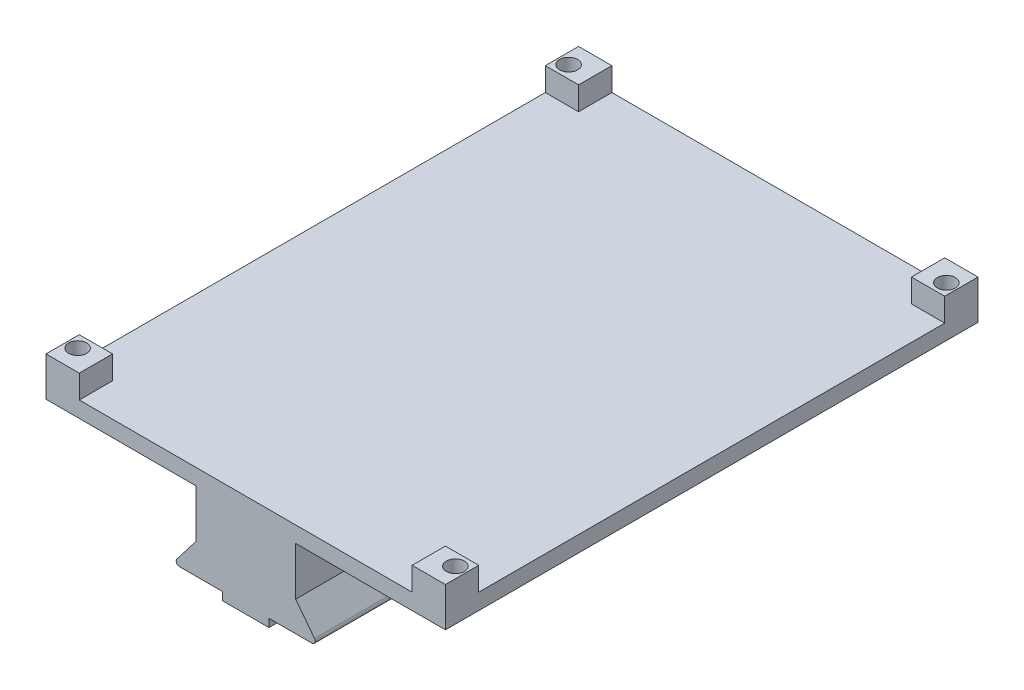
ISO-10303-21;
HEADER;
FILE_DESCRIPTION(('STEP AP214'),'2;1');
FILE_NAME('part.step','',(''),(''),'','','');
FILE_SCHEMA(('AUTOMOTIVE_DESIGN { 1 0 10303 214 1 1 1 1 }'));
ENDSEC;
DATA;
#1=APPLICATION_CONTEXT('core data for automotive mechanical design processes');
#2=APPLICATION_PROTOCOL_DEFINITION('international standard','automotive_design',2000,#1);
#3=PRODUCT_CONTEXT('',#1,'mechanical');
#4=PRODUCT('Part','Part','',(#3));
#5=PRODUCT_RELATED_PRODUCT_CATEGORY('part','',(#4));
#6=PRODUCT_DEFINITION_FORMATION('','',#4);
#7=PRODUCT_DEFINITION_CONTEXT('part definition',#1,'design');
#8=PRODUCT_DEFINITION('design','',#6,#7);
#9=PRODUCT_DEFINITION_SHAPE('','',#8);
#10=(LENGTH_UNIT() NAMED_UNIT(*) SI_UNIT(.MILLI.,.METRE.));
#11=(NAMED_UNIT(*) PLANE_ANGLE_UNIT() SI_UNIT($,.RADIAN.));
#12=(NAMED_UNIT(*) SI_UNIT($,.STERADIAN.) SOLID_ANGLE_UNIT());
#13=UNCERTAINTY_MEASURE_WITH_UNIT(LENGTH_MEASURE(1.E-05),#10,'distance_accuracy_value','');
#14=(GEOMETRIC_REPRESENTATION_CONTEXT(3) GLOBAL_UNCERTAINTY_ASSIGNED_CONTEXT((#13)) GLOBAL_UNIT_ASSIGNED_CONTEXT((#10,
#11,#12)) REPRESENTATION_CONTEXT('',''));
#15=CARTESIAN_POINT('',(0.,0.,0.));
#16=DIRECTION('',(0.,0.,1.));
#17=DIRECTION('',(1.,0.,0.));
#18=AXIS2_PLACEMENT_3D('',#15,#16,#17);
#19=CARTESIAN_POINT('',(38.1,19.5689499131827,101.6));
#20=DIRECTION('',(0.,-1.,0.));
#21=DIRECTION('',(1.,0.,0.));
#22=AXIS2_PLACEMENT_3D('',#19,#20,#21);
#23=PLANE('',#22);
#24=CARTESIAN_POINT('',(36.0362499999997,19.5689499131827,3.96874999999999));
#25=DIRECTION('',(0.,1.,0.));
#26=DIRECTION('',(0.,0.,1.));
#27=AXIS2_PLACEMENT_3D('',#24,#25,#26);
#28=CIRCLE('',#27,1.72719999999999);
#29=CARTESIAN_POINT('',(36.0362499999997,19.5689499131827,5.69594999999998));
#30=VERTEX_POINT('',#29);
#31=EDGE_CURVE('E281',#30,#30,#28,.T.);
#32=ORIENTED_EDGE('',*,*,#31,.F.);
#33=EDGE_LOOP('',(#32));
#34=FACE_BOUND('',#33,.T.);
#35=DIRECTION('',(0.,0.,-1.));
#36=VECTOR('',#35,1.);
#37=CARTESIAN_POINT('',(31.75,19.5689499131827,101.6));
#38=LINE('',#37,#36);
#39=CARTESIAN_POINT('',(31.75,19.5689499131827,6.34999999999999));
#40=VERTEX_POINT('',#39);
#41=CARTESIAN_POINT('',(31.75,19.5689499131827,0.));
#42=VERTEX_POINT('',#41);
#43=EDGE_CURVE('E247',#40,#42,#38,.T.);
#44=ORIENTED_EDGE('',*,*,#43,.F.);
#45=DIRECTION('',(-1.,0.,0.));
#46=VECTOR('',#45,1.);
#47=CARTESIAN_POINT('',(31.75,19.5689499131827,6.34999999999999));
#48=LINE('',#47,#46);
#49=CARTESIAN_POINT('',(38.1,19.5689499131827,6.34999999999999));
#50=VERTEX_POINT('',#49);
#51=EDGE_CURVE('E231',#50,#40,#48,.T.);
#52=ORIENTED_EDGE('',*,*,#51,.F.);
#53=DIRECTION('',(0.,0.,-1.));
#54=VECTOR('',#53,1.);
#55=CARTESIAN_POINT('',(38.1,19.5689499131827,101.6));
#56=LINE('',#55,#54);
#57=CARTESIAN_POINT('',(38.1,19.5689499131827,0.));
#58=VERTEX_POINT('',#57);
#59=EDGE_CURVE('E246',#50,#58,#56,.T.);
#60=ORIENTED_EDGE('',*,*,#59,.T.);
#61=DIRECTION('',(-1.,0.,0.));
#62=VECTOR('',#61,1.);
#63=CARTESIAN_POINT('',(38.1,19.5689499131827,0.));
#64=LINE('',#63,#62);
#65=EDGE_CURVE('E417',#58,#42,#64,.T.);
#66=ORIENTED_EDGE('',*,*,#65,.T.);
#67=EDGE_LOOP('',(#44,#52,#60,#66));
#68=FACE_BOUND('',#67,.T.);
#69=ADVANCED_FACE('F33',(#34,#68),#23,.F.);
#70=CARTESIAN_POINT('',(31.75,19.5689499131827,101.6));
#71=DIRECTION('',(1.,0.,0.));
#72=DIRECTION('',(0.,0.,-1.));
#73=AXIS2_PLACEMENT_3D('',#70,#71,#72);
#74=PLANE('',#73);
#75=DIRECTION('',(0.,0.,-1.));
#76=VECTOR('',#75,1.);
#77=CARTESIAN_POINT('',(31.75,15.1248300482848,101.6));
#78=LINE('',#77,#76);
#79=CARTESIAN_POINT('',(31.75,15.1248300482848,6.34999999999999));
#80=VERTEX_POINT('',#79);
#81=CARTESIAN_POINT('',(31.75,15.1248300482848,0.));
#82=VERTEX_POINT('',#81);
#83=EDGE_CURVE('E455',#80,#82,#78,.T.);
#84=ORIENTED_EDGE('',*,*,#83,.F.);
#85=DIRECTION('',(0.,1.,0.));
#86=VECTOR('',#85,1.);
#87=CARTESIAN_POINT('',(31.75,-74.0016671340908,6.34999999999999));
#88=LINE('',#87,#86);
#89=EDGE_CURVE('E50',#80,#40,#88,.T.);
#90=ORIENTED_EDGE('',*,*,#89,.T.);
#91=ORIENTED_EDGE('',*,*,#43,.T.);
#92=DIRECTION('',(0.,-1.,0.));
#93=VECTOR('',#92,1.);
#94=CARTESIAN_POINT('',(31.75,19.5689499131827,0.));
#95=LINE('',#94,#93);
#96=EDGE_CURVE('E420',#42,#82,#95,.T.);
#97=ORIENTED_EDGE('',*,*,#96,.T.);
#98=EDGE_LOOP('',(#84,#90,#91,#97));
#99=FACE_BOUND('',#98,.T.);
#100=ADVANCED_FACE('F559',(#99),#74,.F.);
#101=CARTESIAN_POINT('',(-31.75,19.5689499131827,101.6));
#102=DIRECTION('',(1.,0.,0.));
#103=DIRECTION('',(0.,0.,-1.));
#104=AXIS2_PLACEMENT_3D('',#101,#102,#103);
#105=PLANE('',#104);
#106=DIRECTION('',(0.,1.,0.));
#107=VECTOR('',#106,1.);
#108=CARTESIAN_POINT('',(-31.75,-74.0016671340908,6.34999999999999));
#109=LINE('',#108,#107);
#110=CARTESIAN_POINT('',(-31.75,15.1248300482848,6.34999999999999));
#111=VERTEX_POINT('',#110);
#112=CARTESIAN_POINT('',(-31.75,19.5689499131827,6.34999999999999));
#113=VERTEX_POINT('',#112);
#114=EDGE_CURVE('E326',#111,#113,#109,.T.);
#115=ORIENTED_EDGE('',*,*,#114,.F.);
#116=DIRECTION('',(0.,0.,-1.));
#117=VECTOR('',#116,1.);
#118=CARTESIAN_POINT('',(-31.75,15.1248300482848,101.6));
#119=LINE('',#118,#117);
#120=CARTESIAN_POINT('',(-31.75,15.1248300482848,0.));
#121=VERTEX_POINT('',#120);
#122=EDGE_CURVE('E452',#111,#121,#119,.T.);
#123=ORIENTED_EDGE('',*,*,#122,.T.);
#124=DIRECTION('',(0.,-1.,0.));
#125=VECTOR('',#124,1.);
#126=CARTESIAN_POINT('',(-31.75,19.5689499131827,0.));
#127=LINE('',#126,#125);
#128=CARTESIAN_POINT('',(-31.75,19.5689499131827,0.));
#129=VERTEX_POINT('',#128);
#130=EDGE_CURVE('E426',#129,#121,#127,.T.);
#131=ORIENTED_EDGE('',*,*,#130,.F.);
#132=DIRECTION('',(0.,0.,-1.));
#133=VECTOR('',#132,1.);
#134=CARTESIAN_POINT('',(-31.75,19.5689499131827,101.6));
#135=LINE('',#134,#133);
#136=EDGE_CURVE('E449',#113,#129,#135,.T.);
#137=ORIENTED_EDGE('',*,*,#136,.F.);
#138=EDGE_LOOP('',(#115,#123,#131,#137));
#139=FACE_BOUND('',#138,.T.);
#140=ADVANCED_FACE('F462',(#139),#105,.T.);
#141=CARTESIAN_POINT('',(-38.1,19.5689499131827,101.6));
#142=DIRECTION('',(0.,1.,0.));
#143=DIRECTION('',(0.,0.,1.));
#144=AXIS2_PLACEMENT_3D('',#141,#142,#143);
#145=PLANE('',#144);
#146=CARTESIAN_POINT('',(-36.0362500000004,19.5689499131827,3.96874999999999));
#147=DIRECTION('',(0.,1.,0.));
#148=DIRECTION('',(0.,0.,1.));
#149=AXIS2_PLACEMENT_3D('',#146,#147,#148);
#150=CIRCLE('',#149,1.72719999999999);
#151=CARTESIAN_POINT('',(-36.0362500000004,19.5689499131827,5.69594999999998));
#152=VERTEX_POINT('',#151);
#153=EDGE_CURVE('E298',#152,#152,#150,.T.);
#154=ORIENTED_EDGE('',*,*,#153,.F.);
#155=EDGE_LOOP('',(#154));
#156=FACE_BOUND('',#155,.T.);
#157=DIRECTION('',(-1.,0.,0.));
#158=VECTOR('',#157,1.);
#159=CARTESIAN_POINT('',(-38.1,19.5689499131827,6.34999999999999));
#160=LINE('',#159,#158);
#161=CARTESIAN_POINT('',(-38.1,19.5689499131827,6.34999999999999));
#162=VERTEX_POINT('',#161);
#163=EDGE_CURVE('E322',#113,#162,#160,.T.);
#164=ORIENTED_EDGE('',*,*,#163,.F.);
#165=ORIENTED_EDGE('',*,*,#136,.T.);
#166=DIRECTION('',(1.,0.,0.));
#167=VECTOR('',#166,1.);
#168=CARTESIAN_POINT('',(-38.1,19.5689499131827,0.));
#169=LINE('',#168,#167);
#170=CARTESIAN_POINT('',(-38.1,19.5689499131827,0.));
#171=VERTEX_POINT('',#170);
#172=EDGE_CURVE('E429',#171,#129,#169,.T.);
#173=ORIENTED_EDGE('',*,*,#172,.F.);
#174=DIRECTION('',(0.,0.,-1.));
#175=VECTOR('',#174,1.);
#176=CARTESIAN_POINT('',(-38.1,19.5689499131827,101.6));
#177=LINE('',#176,#175);
#178=EDGE_CURVE('E445',#162,#171,#177,.T.);
#179=ORIENTED_EDGE('',*,*,#178,.F.);
#180=EDGE_LOOP('',(#164,#165,#173,#179));
#181=FACE_BOUND('',#180,.T.);
#182=ADVANCED_FACE('F476',(#156,#181),#145,.T.);
#183=CARTESIAN_POINT('',(-9.525,2.8575,101.6));
#184=DIRECTION('',(0.793353340291239,-0.608761429008716,0.));
#185=DIRECTION('',(0.608761429008716,0.793353340291239,0.));
#186=AXIS2_PLACEMENT_3D('',#183,#184,#185);
#187=PLANE('',#186);
#188=DIRECTION('',(-0.608761429008716,-0.793353340291239,0.));
#189=VECTOR('',#188,1.);
#190=CARTESIAN_POINT('',(-9.525,2.8575,0.));
#191=LINE('',#190,#189);
#192=CARTESIAN_POINT('',(-9.525,2.8575,0.));
#193=VERTEX_POINT('',#192);
#194=CARTESIAN_POINT('',(-13.1264005164605,-1.83593653081475,0.));
#195=VERTEX_POINT('',#194);
#196=EDGE_CURVE('E333',#193,#195,#191,.T.);
#197=ORIENTED_EDGE('',*,*,#196,.T.);
#198=DIRECTION('',(0.,0.,-1.));
#199=VECTOR('',#198,1.);
#200=CARTESIAN_POINT('',(-13.1264005164605,-1.83593653081475,101.6));
#201=LINE('',#200,#199);
#202=CARTESIAN_POINT('',(-13.1264005164605,-1.83593653081475,101.6));
#203=VERTEX_POINT('',#202);
#204=EDGE_CURVE('E11',#203,#195,#201,.T.);
#205=ORIENTED_EDGE('',*,*,#204,.F.);
#206=DIRECTION('',(-0.608761429008716,-0.793353340291239,0.));
#207=VECTOR('',#206,1.);
#208=CARTESIAN_POINT('',(-9.525,2.8575,101.6));
#209=LINE('',#208,#207);
#210=CARTESIAN_POINT('',(-9.525,2.8575,101.6));
#211=VERTEX_POINT('',#210);
#212=EDGE_CURVE('E334',#211,#203,#209,.T.);
#213=ORIENTED_EDGE('',*,*,#212,.F.);
#214=DIRECTION('',(0.,0.,-1.));
#215=VECTOR('',#214,1.);
#216=CARTESIAN_POINT('',(-9.525,2.8575,101.6));
#217=LINE('',#216,#215);
#218=EDGE_CURVE('E385',#211,#193,#217,.T.);
#219=ORIENTED_EDGE('',*,*,#218,.T.);
#220=EDGE_LOOP('',(#197,#205,#213,#219));
#221=FACE_BOUND('',#220,.T.);
#222=ADVANCED_FACE('F35',(#221),#187,.F.);
#223=CARTESIAN_POINT('',(-12.6226211160366,-2.2225,101.6));
#224=DIRECTION('',(0.,0.,-1.));
#225=DIRECTION('',(-1.,0.,0.));
#226=AXIS2_PLACEMENT_3D('',#223,#224,#225);
#227=CYLINDRICAL_SURFACE('',#226,0.634999999999999);
#228=CARTESIAN_POINT('',(-12.6226211160366,-2.2225,0.));
#229=DIRECTION('',(0.,0.,1.));
#230=DIRECTION('',(1.,0.,0.));
#231=AXIS2_PLACEMENT_3D('',#228,#229,#230);
#232=CIRCLE('',#231,0.634999999999999);
#233=CARTESIAN_POINT('',(-12.622621186,-2.8575,0.));
#234=VERTEX_POINT('',#233);
#235=EDGE_CURVE('E388',#195,#234,#232,.T.);
#236=ORIENTED_EDGE('',*,*,#235,.T.);
#237=DIRECTION('',(0.,0.,-1.));
#238=VECTOR('',#237,1.);
#239=CARTESIAN_POINT('',(-12.622621186,-2.8575,101.6));
#240=LINE('',#239,#238);
#241=CARTESIAN_POINT('',(-12.622621186,-2.8575,101.6));
#242=VERTEX_POINT('',#241);
#243=EDGE_CURVE('E42',#242,#234,#240,.T.);
#244=ORIENTED_EDGE('',*,*,#243,.F.);
#245=CARTESIAN_POINT('',(-12.6226211160366,-2.2225,101.6));
#246=DIRECTION('',(0.,0.,1.));
#247=DIRECTION('',(1.,0.,0.));
#248=AXIS2_PLACEMENT_3D('',#245,#246,#247);
#249=CIRCLE('',#248,0.634999999999999);
#250=EDGE_CURVE('E337',#203,#242,#249,.T.);
#251=ORIENTED_EDGE('',*,*,#250,.F.);
#252=ORIENTED_EDGE('',*,*,#204,.T.);
#253=EDGE_LOOP('',(#236,#244,#251,#252));
#254=FACE_BOUND('',#253,.T.);
#255=ADVANCED_FACE('F509',(#254),#227,.T.);
#256=CARTESIAN_POINT('',(-9.525,-2.8575,101.6));
#257=DIRECTION('',(0.,1.,0.));
#258=DIRECTION('',(-1.,0.,0.));
#259=AXIS2_PLACEMENT_3D('',#256,#257,#258);
#260=PLANE('',#259);
#261=DIRECTION('',(1.,0.,0.));
#262=VECTOR('',#261,1.);
#263=CARTESIAN_POINT('',(-9.525,-2.8575,0.));
#264=LINE('',#263,#262);
#265=CARTESIAN_POINT('',(-4.445,-2.8575,0.));
#266=VERTEX_POINT('',#265);
#267=EDGE_CURVE('E391',#234,#266,#264,.T.);
#268=ORIENTED_EDGE('',*,*,#267,.T.);
#269=DIRECTION('',(0.,0.,-1.));
#270=VECTOR('',#269,1.);
#271=CARTESIAN_POINT('',(-4.445,-2.8575,101.6));
#272=LINE('',#271,#270);
#273=CARTESIAN_POINT('',(-4.445,-2.8575,101.6));
#274=VERTEX_POINT('',#273);
#275=EDGE_CURVE('E275',#274,#266,#272,.T.);
#276=ORIENTED_EDGE('',*,*,#275,.F.);
#277=DIRECTION('',(-1.,0.,0.));
#278=VECTOR('',#277,1.);
#279=CARTESIAN_POINT('',(-9.525,-2.8575,101.6));
#280=LINE('',#279,#278);
#281=EDGE_CURVE('E340',#274,#242,#280,.T.);
#282=ORIENTED_EDGE('',*,*,#281,.T.);
#283=ORIENTED_EDGE('',*,*,#243,.T.);
#284=EDGE_LOOP('',(#268,#276,#282,#283));
#285=FACE_BOUND('',#284,.T.);
#286=ADVANCED_FACE('F511',(#285),#260,.F.);
#287=CARTESIAN_POINT('',(-4.445,-2.8575,101.6));
#288=DIRECTION('',(1.,0.,0.));
#289=DIRECTION('',(0.,0.,-1.));
#290=AXIS2_PLACEMENT_3D('',#287,#288,#289);
#291=PLANE('',#290);
#292=DIRECTION('',(0.,-1.,0.));
#293=VECTOR('',#292,1.);
#294=CARTESIAN_POINT('',(-4.445,-2.8575,0.));
#295=LINE('',#294,#293);
#296=CARTESIAN_POINT('',(-4.445,-4.3815,0.));
#297=VERTEX_POINT('',#296);
#298=EDGE_CURVE('E393',#266,#297,#295,.T.);
#299=ORIENTED_EDGE('',*,*,#298,.T.);
#300=DIRECTION('',(0.,0.,-1.));
#301=VECTOR('',#300,1.);
#302=CARTESIAN_POINT('',(-4.445,-4.3815,101.6));
#303=LINE('',#302,#301);
#304=CARTESIAN_POINT('',(-4.445,-4.3815,101.6));
#305=VERTEX_POINT('',#304);
#306=EDGE_CURVE('E272',#305,#297,#303,.T.);
#307=ORIENTED_EDGE('',*,*,#306,.F.);
#308=DIRECTION('',(0.,-1.,0.));
#309=VECTOR('',#308,1.);
#310=CARTESIAN_POINT('',(-4.445,-2.8575,101.6));
#311=LINE('',#310,#309);
#312=EDGE_CURVE('E343',#274,#305,#311,.T.);
#313=ORIENTED_EDGE('',*,*,#312,.F.);
#314=ORIENTED_EDGE('',*,*,#275,.T.);
#315=EDGE_LOOP('',(#299,#307,#313,#314));
#316=FACE_BOUND('',#315,.T.);
#317=ADVANCED_FACE('F516',(#316),#291,.F.);
#318=CARTESIAN_POINT('',(-4.445,-4.3815,101.6));
#319=DIRECTION('',(0.,1.,0.));
#320=DIRECTION('',(-1.,0.,0.));
#321=AXIS2_PLACEMENT_3D('',#318,#319,#320);
#322=PLANE('',#321);
#323=DIRECTION('',(1.,0.,0.));
#324=VECTOR('',#323,1.);
#325=CARTESIAN_POINT('',(-4.445,-4.3815,0.));
#326=LINE('',#325,#324);
#327=CARTESIAN_POINT('',(4.445,-4.3815,0.));
#328=VERTEX_POINT('',#327);
#329=EDGE_CURVE('E395',#297,#328,#326,.T.);
#330=ORIENTED_EDGE('',*,*,#329,.T.);
#331=DIRECTION('',(0.,0.,-1.));
#332=VECTOR('',#331,1.);
#333=CARTESIAN_POINT('',(4.445,-4.3815,101.6));
#334=LINE('',#333,#332);
#335=CARTESIAN_POINT('',(4.445,-4.3815,101.6));
#336=VERTEX_POINT('',#335);
#337=EDGE_CURVE('E270',#336,#328,#334,.T.);
#338=ORIENTED_EDGE('',*,*,#337,.F.);
#339=DIRECTION('',(1.,0.,0.));
#340=VECTOR('',#339,1.);
#341=CARTESIAN_POINT('',(-4.445,-4.3815,101.6));
#342=LINE('',#341,#340);
#343=EDGE_CURVE('E345',#305,#336,#342,.T.);
#344=ORIENTED_EDGE('',*,*,#343,.F.);
#345=ORIENTED_EDGE('',*,*,#306,.T.);
#346=EDGE_LOOP('',(#330,#338,#344,#345));
#347=FACE_BOUND('',#346,.T.);
#348=ADVANCED_FACE('F521',(#347),#322,.F.);
#349=CARTESIAN_POINT('',(4.445,-2.8575,101.6));
#350=DIRECTION('',(1.,0.,0.));
#351=DIRECTION('',(0.,0.,-1.));
#352=AXIS2_PLACEMENT_3D('',#349,#350,#351);
#353=PLANE('',#352);
#354=DIRECTION('',(0.,-1.,0.));
#355=VECTOR('',#354,1.);
#356=CARTESIAN_POINT('',(4.445,-2.8575,0.));
#357=LINE('',#356,#355);
#358=CARTESIAN_POINT('',(4.445,-2.8575,0.));
#359=VERTEX_POINT('',#358);
#360=EDGE_CURVE('E398',#359,#328,#357,.T.);
#361=ORIENTED_EDGE('',*,*,#360,.F.);
#362=DIRECTION('',(0.,0.,-1.));
#363=VECTOR('',#362,1.);
#364=CARTESIAN_POINT('',(4.445,-2.8575,101.6));
#365=LINE('',#364,#363);
#366=CARTESIAN_POINT('',(4.445,-2.8575,101.6));
#367=VERTEX_POINT('',#366);
#368=EDGE_CURVE('E267',#367,#359,#365,.T.);
#369=ORIENTED_EDGE('',*,*,#368,.F.);
#370=DIRECTION('',(0.,-1.,0.));
#371=VECTOR('',#370,1.);
#372=CARTESIAN_POINT('',(4.445,-2.8575,101.6));
#373=LINE('',#372,#371);
#374=EDGE_CURVE('E347',#367,#336,#373,.T.);
#375=ORIENTED_EDGE('',*,*,#374,.T.);
#376=ORIENTED_EDGE('',*,*,#337,.T.);
#377=EDGE_LOOP('',(#361,#369,#375,#376));
#378=FACE_BOUND('',#377,.T.);
#379=ADVANCED_FACE('F525',(#378),#353,.T.);
#380=CARTESIAN_POINT('',(9.525,-2.8575,101.6));
#381=DIRECTION('',(0.,1.,0.));
#382=DIRECTION('',(-1.,0.,0.));
#383=AXIS2_PLACEMENT_3D('',#380,#381,#382);
#384=PLANE('',#383);
#385=DIRECTION('',(1.,0.,0.));
#386=VECTOR('',#385,1.);
#387=CARTESIAN_POINT('',(9.525,-2.8575,0.));
#388=LINE('',#387,#386);
#389=CARTESIAN_POINT('',(12.622621186,-2.8575,0.));
#390=VERTEX_POINT('',#389);
#391=EDGE_CURVE('E401',#359,#390,#388,.T.);
#392=ORIENTED_EDGE('',*,*,#391,.T.);
#393=DIRECTION('',(0.,0.,-1.));
#394=VECTOR('',#393,1.);
#395=CARTESIAN_POINT('',(12.622621186,-2.8575,101.6));
#396=LINE('',#395,#394);
#397=CARTESIAN_POINT('',(12.622621186,-2.8575,101.6));
#398=VERTEX_POINT('',#397);
#399=EDGE_CURVE('E265',#398,#390,#396,.T.);
#400=ORIENTED_EDGE('',*,*,#399,.F.);
#401=DIRECTION('',(1.,0.,0.));
#402=VECTOR('',#401,1.);
#403=CARTESIAN_POINT('',(4.445,-2.8575,101.6));
#404=LINE('',#403,#402);
#405=EDGE_CURVE('E350',#367,#398,#404,.T.);
#406=ORIENTED_EDGE('',*,*,#405,.F.);
#407=ORIENTED_EDGE('',*,*,#368,.T.);
#408=EDGE_LOOP('',(#392,#400,#406,#407));
#409=FACE_BOUND('',#408,.T.);
#410=ADVANCED_FACE('F529',(#409),#384,.F.);
#411=CARTESIAN_POINT('',(12.6226211160366,-2.2225,101.6));
#412=DIRECTION('',(0.,0.,-1.));
#413=DIRECTION('',(-1.,0.,0.));
#414=AXIS2_PLACEMENT_3D('',#411,#412,#413);
#415=CYLINDRICAL_SURFACE('',#414,0.634999999999999);
#416=CARTESIAN_POINT('',(12.6226211160366,-2.2225,0.));
#417=DIRECTION('',(0.,0.,-1.));
#418=DIRECTION('',(-1.,0.,0.));
#419=AXIS2_PLACEMENT_3D('',#416,#417,#418);
#420=CIRCLE('',#419,0.634999999999999);
#421=CARTESIAN_POINT('',(13.1264005164605,-1.83593653081475,0.));
#422=VERTEX_POINT('',#421);
#423=EDGE_CURVE('E404',#422,#390,#420,.T.);
#424=ORIENTED_EDGE('',*,*,#423,.F.);
#425=DIRECTION('',(0.,0.,-1.));
#426=VECTOR('',#425,1.);
#427=CARTESIAN_POINT('',(13.1264005164605,-1.83593653081475,101.6));
#428=LINE('',#427,#426);
#429=CARTESIAN_POINT('',(13.1264005164605,-1.83593653081475,101.6));
#430=VERTEX_POINT('',#429);
#431=EDGE_CURVE('E263',#430,#422,#428,.T.);
#432=ORIENTED_EDGE('',*,*,#431,.F.);
#433=CARTESIAN_POINT('',(12.6226211160366,-2.2225,101.6));
#434=DIRECTION('',(0.,0.,-1.));
#435=DIRECTION('',(-1.,0.,0.));
#436=AXIS2_PLACEMENT_3D('',#433,#434,#435);
#437=CIRCLE('',#436,0.634999999999999);
#438=EDGE_CURVE('E352',#430,#398,#437,.T.);
#439=ORIENTED_EDGE('',*,*,#438,.T.);
#440=ORIENTED_EDGE('',*,*,#399,.T.);
#441=EDGE_LOOP('',(#424,#432,#439,#440));
#442=FACE_BOUND('',#441,.T.);
#443=ADVANCED_FACE('F560',(#442),#415,.T.);
#444=CARTESIAN_POINT('',(9.525,2.8575,101.6));
#445=DIRECTION('',(0.793353340291239,0.608761429008716,0.));
#446=DIRECTION('',(-0.608761429008716,0.793353340291239,0.));
#447=AXIS2_PLACEMENT_3D('',#444,#445,#446);
#448=PLANE('',#447);
#449=DIRECTION('',(0.608761429008716,-0.793353340291239,0.));
#450=VECTOR('',#449,1.);
#451=CARTESIAN_POINT('',(9.525,2.8575,0.));
#452=LINE('',#451,#450);
#453=CARTESIAN_POINT('',(9.525,2.8575,0.));
#454=VERTEX_POINT('',#453);
#455=EDGE_CURVE('E407',#454,#422,#452,.T.);
#456=ORIENTED_EDGE('',*,*,#455,.F.);
#457=DIRECTION('',(0.,0.,-1.));
#458=VECTOR('',#457,1.);
#459=CARTESIAN_POINT('',(9.525,2.8575,101.6));
#460=LINE('',#459,#458);
#461=CARTESIAN_POINT('',(9.525,2.8575,101.6));
#462=VERTEX_POINT('',#461);
#463=EDGE_CURVE('E260',#462,#454,#460,.T.);
#464=ORIENTED_EDGE('',*,*,#463,.F.);
#465=DIRECTION('',(0.608761429008716,-0.793353340291239,0.));
#466=VECTOR('',#465,1.);
#467=CARTESIAN_POINT('',(9.525,2.8575,101.6));
#468=LINE('',#467,#466);
#469=EDGE_CURVE('E355',#462,#430,#468,.T.);
#470=ORIENTED_EDGE('',*,*,#469,.T.);
#471=ORIENTED_EDGE('',*,*,#431,.T.);
#472=EDGE_LOOP('',(#456,#464,#470,#471));
#473=FACE_BOUND('',#472,.T.);
#474=ADVANCED_FACE('F535',(#473),#448,.T.);
#475=CARTESIAN_POINT('',(9.525,4.453010906,101.6));
#476=DIRECTION('',(-1.,0.,0.));
#477=DIRECTION('',(0.,0.,1.));
#478=AXIS2_PLACEMENT_3D('',#475,#476,#477);
#479=PLANE('',#478);
#480=DIRECTION('',(0.,1.,0.));
#481=VECTOR('',#480,1.);
#482=CARTESIAN_POINT('',(9.525,4.453010906,0.));
#483=LINE('',#482,#481);
#484=CARTESIAN_POINT('',(9.525,12.073010906,0.));
#485=VERTEX_POINT('',#484);
#486=EDGE_CURVE('E410',#454,#485,#483,.T.);
#487=ORIENTED_EDGE('',*,*,#486,.T.);
#488=DIRECTION('',(0.,0.,-1.));
#489=VECTOR('',#488,1.);
#490=CARTESIAN_POINT('',(9.525,12.073010906,101.6));
#491=LINE('',#490,#489);
#492=CARTESIAN_POINT('',(9.525,12.073010906,101.6));
#493=VERTEX_POINT('',#492);
#494=EDGE_CURVE('E257',#493,#485,#491,.T.);
#495=ORIENTED_EDGE('',*,*,#494,.F.);
#496=DIRECTION('',(0.,1.,0.));
#497=VECTOR('',#496,1.);
#498=CARTESIAN_POINT('',(9.525,2.8575,101.6));
#499=LINE('',#498,#497);
#500=EDGE_CURVE('E358',#462,#493,#499,.T.);
#501=ORIENTED_EDGE('',*,*,#500,.F.);
#502=ORIENTED_EDGE('',*,*,#463,.T.);
#503=EDGE_LOOP('',(#487,#495,#501,#502));
#504=FACE_BOUND('',#503,.T.);
#505=ADVANCED_FACE('F540',(#504),#479,.F.);
#506=CARTESIAN_POINT('',(9.525,12.073010906,101.6));
#507=DIRECTION('',(0.,1.,0.));
#508=DIRECTION('',(-1.,0.,0.));
#509=AXIS2_PLACEMENT_3D('',#506,#507,#508);
#510=PLANE('',#509);
#511=CARTESIAN_POINT('',(36.0362499999997,12.073010906,97.63125));
#512=DIRECTION('',(0.,1.,0.));
#513=DIRECTION('',(-1.,0.,0.));
#514=AXIS2_PLACEMENT_3D('',#511,#512,#513);
#515=CIRCLE('',#514,1.72719999999999);
#516=CARTESIAN_POINT('',(34.3090499999997,12.073010906,97.63125));
#517=VERTEX_POINT('',#516);
#518=EDGE_CURVE('E37',#517,#517,#515,.T.);
#519=ORIENTED_EDGE('',*,*,#518,.T.);
#520=EDGE_LOOP('',(#519));
#521=FACE_BOUND('',#520,.T.);
#522=CARTESIAN_POINT('',(36.0362499999997,12.073010906,3.96874999999999));
#523=DIRECTION('',(0.,1.,0.));
#524=DIRECTION('',(-1.,0.,0.));
#525=AXIS2_PLACEMENT_3D('',#522,#523,#524);
#526=CIRCLE('',#525,1.72719999999999);
#527=CARTESIAN_POINT('',(34.3090499999997,12.073010906,3.96874999999999));
#528=VERTEX_POINT('',#527);
#529=EDGE_CURVE('E286',#528,#528,#526,.T.);
#530=ORIENTED_EDGE('',*,*,#529,.T.);
#531=EDGE_LOOP('',(#530));
#532=FACE_BOUND('',#531,.T.);
#533=DIRECTION('',(1.,0.,0.));
#534=VECTOR('',#533,1.);
#535=CARTESIAN_POINT('',(9.525,12.073010906,0.));
#536=LINE('',#535,#534);
#537=CARTESIAN_POINT('',(38.1,12.073010906,0.));
#538=VERTEX_POINT('',#537);
#539=EDGE_CURVE('E412',#485,#538,#536,.T.);
#540=ORIENTED_EDGE('',*,*,#539,.T.);
#541=DIRECTION('',(0.,0.,-1.));
#542=VECTOR('',#541,1.);
#543=CARTESIAN_POINT('',(38.1,12.073010906,101.6));
#544=LINE('',#543,#542);
#545=CARTESIAN_POINT('',(38.1,12.073010906,101.6));
#546=VERTEX_POINT('',#545);
#547=EDGE_CURVE('E254',#546,#538,#544,.T.);
#548=ORIENTED_EDGE('',*,*,#547,.F.);
#549=DIRECTION('',(1.,0.,0.));
#550=VECTOR('',#549,1.);
#551=CARTESIAN_POINT('',(9.525,12.073010906,101.6));
#552=LINE('',#551,#550);
#553=EDGE_CURVE('E360',#493,#546,#552,.T.);
#554=ORIENTED_EDGE('',*,*,#553,.F.);
#555=ORIENTED_EDGE('',*,*,#494,.T.);
#556=EDGE_LOOP('',(#540,#548,#554,#555));
#557=FACE_BOUND('',#556,.T.);
#558=ADVANCED_FACE('F545',(#521,#532,#557),#510,.F.);
#559=CARTESIAN_POINT('',(38.1,12.073010906,101.6));
#560=DIRECTION('',(-1.,0.,0.));
#561=DIRECTION('',(0.,-1.,0.));
#562=AXIS2_PLACEMENT_3D('',#559,#560,#561);
#563=PLANE('',#562);
#564=ORIENTED_EDGE('',*,*,#59,.F.);
#565=DIRECTION('',(0.,1.,0.));
#566=VECTOR('',#565,1.);
#567=CARTESIAN_POINT('',(38.1,-74.0016671340908,6.34999999999999));
#568=LINE('',#567,#566);
#569=CARTESIAN_POINT('',(38.1,15.1248300482848,6.34999999999999));
#570=VERTEX_POINT('',#569);
#571=EDGE_CURVE('E310',#570,#50,#568,.T.);
#572=ORIENTED_EDGE('',*,*,#571,.F.);
#573=DIRECTION('',(0.,0.,1.));
#574=VECTOR('',#573,1.);
#575=CARTESIAN_POINT('',(38.1,15.1248300482848,6.34999999999999));
#576=LINE('',#575,#574);
#577=CARTESIAN_POINT('',(38.1,15.1248300482847,95.25));
#578=VERTEX_POINT('',#577);
#579=EDGE_CURVE('E303',#570,#578,#576,.T.);
#580=ORIENTED_EDGE('',*,*,#579,.T.);
#581=DIRECTION('',(0.,1.,0.));
#582=VECTOR('',#581,1.);
#583=CARTESIAN_POINT('',(38.1,-74.0016671340908,95.25));
#584=LINE('',#583,#582);
#585=CARTESIAN_POINT('',(38.1,19.5689499131827,95.25));
#586=VERTEX_POINT('',#585);
#587=EDGE_CURVE('E230',#578,#586,#584,.T.);
#588=ORIENTED_EDGE('',*,*,#587,.T.);
#589=CARTESIAN_POINT('',(38.1,19.5689499131827,101.6));
#590=VERTEX_POINT('',#589);
#591=EDGE_CURVE('E241',#590,#586,#56,.T.);
#592=ORIENTED_EDGE('',*,*,#591,.F.);
#593=DIRECTION('',(0.,1.,0.));
#594=VECTOR('',#593,1.);
#595=CARTESIAN_POINT('',(38.1,12.073010906,101.6));
#596=LINE('',#595,#594);
#597=EDGE_CURVE('E362',#546,#590,#596,.T.);
#598=ORIENTED_EDGE('',*,*,#597,.F.);
#599=ORIENTED_EDGE('',*,*,#547,.T.);
#600=DIRECTION('',(0.,1.,0.));
#601=VECTOR('',#600,1.);
#602=CARTESIAN_POINT('',(38.1,12.073010906,0.));
#603=LINE('',#602,#601);
#604=EDGE_CURVE('E414',#538,#58,#603,.T.);
#605=ORIENTED_EDGE('',*,*,#604,.T.);
#606=EDGE_LOOP('',(#564,#572,#580,#588,#592,#598,#599,#605));
#607=FACE_BOUND('',#606,.T.);
#608=ADVANCED_FACE('F550',(#607),#563,.F.);
#609=CARTESIAN_POINT('',(36.0362499999997,19.5689499131827,97.63125));
#610=DIRECTION('',(0.,1.,0.));
#611=DIRECTION('',(0.,0.,1.));
#612=AXIS2_PLACEMENT_3D('',#609,#610,#611);
#613=CIRCLE('',#612,1.72719999999999);
#614=CARTESIAN_POINT('',(36.0362499999997,19.5689499131827,99.35845));
#615=VERTEX_POINT('',#614);
#616=EDGE_CURVE('E293',#615,#615,#613,.T.);
#617=ORIENTED_EDGE('',*,*,#616,.F.);
#618=EDGE_LOOP('',(#617));
#619=FACE_BOUND('',#618,.T.);
#620=ORIENTED_EDGE('',*,*,#591,.T.);
#621=DIRECTION('',(1.,0.,0.));
#622=VECTOR('',#621,1.);
#623=CARTESIAN_POINT('',(31.75,19.5689499131827,95.25));
#624=LINE('',#623,#622);
#625=CARTESIAN_POINT('',(31.75,19.5689499131827,95.25));
#626=VERTEX_POINT('',#625);
#627=EDGE_CURVE('E222',#626,#586,#624,.T.);
#628=ORIENTED_EDGE('',*,*,#627,.F.);
#629=CARTESIAN_POINT('',(31.75,19.5689499131827,101.6));
#630=VERTEX_POINT('',#629);
#631=EDGE_CURVE('E238',#630,#626,#38,.T.);
#632=ORIENTED_EDGE('',*,*,#631,.F.);
#633=DIRECTION('',(-1.,0.,0.));
#634=VECTOR('',#633,1.);
#635=CARTESIAN_POINT('',(38.1,19.5689499131827,101.6));
#636=LINE('',#635,#634);
#637=EDGE_CURVE('E364',#590,#630,#636,.T.);
#638=ORIENTED_EDGE('',*,*,#637,.F.);
#639=EDGE_LOOP('',(#620,#628,#632,#638));
#640=FACE_BOUND('',#639,.T.);
#641=ADVANCED_FACE('F236',(#619,#640),#23,.F.);
#642=ORIENTED_EDGE('',*,*,#631,.T.);
#643=DIRECTION('',(0.,1.,0.));
#644=VECTOR('',#643,1.);
#645=CARTESIAN_POINT('',(31.75,-74.0016671340908,95.25));
#646=LINE('',#645,#644);
#647=CARTESIAN_POINT('',(31.75,15.1248300482848,95.25));
#648=VERTEX_POINT('',#647);
#649=EDGE_CURVE('E219',#648,#626,#646,.T.);
#650=ORIENTED_EDGE('',*,*,#649,.F.);
#651=CARTESIAN_POINT('',(31.75,15.1248300482848,101.6));
#652=VERTEX_POINT('',#651);
#653=EDGE_CURVE('E250',#652,#648,#78,.T.);
#654=ORIENTED_EDGE('',*,*,#653,.F.);
#655=DIRECTION('',(0.,-1.,0.));
#656=VECTOR('',#655,1.);
#657=CARTESIAN_POINT('',(31.75,19.5689499131827,101.6));
#658=LINE('',#657,#656);
#659=EDGE_CURVE('E245',#630,#652,#658,.T.);
#660=ORIENTED_EDGE('',*,*,#659,.F.);
#661=EDGE_LOOP('',(#642,#650,#654,#660));
#662=FACE_BOUND('',#661,.T.);
#663=ADVANCED_FACE('F244',(#662),#74,.F.);
#664=CARTESIAN_POINT('',(-31.75,15.1248300482848,101.6));
#665=DIRECTION('',(0.,1.,0.));
#666=DIRECTION('',(0.,0.,1.));
#667=AXIS2_PLACEMENT_3D('',#664,#665,#666);
#668=PLANE('',#667);
#669=DIRECTION('',(1.,0.,0.));
#670=VECTOR('',#669,1.);
#671=CARTESIAN_POINT('',(-31.75,15.1248300482848,0.));
#672=LINE('',#671,#670);
#673=EDGE_CURVE('E423',#121,#82,#672,.T.);
#674=ORIENTED_EDGE('',*,*,#673,.F.);
#675=ORIENTED_EDGE('',*,*,#122,.F.);
#676=DIRECTION('',(1.,0.,0.));
#677=VECTOR('',#676,1.);
#678=CARTESIAN_POINT('',(-38.1,15.1248300482848,6.34999999999999));
#679=LINE('',#678,#677);
#680=CARTESIAN_POINT('',(-38.1,15.1248300482848,6.34999999999999));
#681=VERTEX_POINT('',#680);
#682=EDGE_CURVE('E315',#681,#111,#679,.T.);
#683=ORIENTED_EDGE('',*,*,#682,.F.);
#684=DIRECTION('',(0.,0.,-1.));
#685=VECTOR('',#684,1.);
#686=CARTESIAN_POINT('',(-38.1,15.1248300482848,6.34999999999999));
#687=LINE('',#686,#685);
#688=CARTESIAN_POINT('',(-38.1,15.1248300482848,95.25));
#689=VERTEX_POINT('',#688);
#690=EDGE_CURVE('E317',#689,#681,#687,.T.);
#691=ORIENTED_EDGE('',*,*,#690,.F.);
#692=DIRECTION('',(-1.,0.,0.));
#693=VECTOR('',#692,1.);
#694=CARTESIAN_POINT('',(-38.1,15.1248300482848,95.25));
#695=LINE('',#694,#693);
#696=CARTESIAN_POINT('',(-31.75,15.1248300482848,95.25));
#697=VERTEX_POINT('',#696);
#698=EDGE_CURVE('E320',#697,#689,#695,.T.);
#699=ORIENTED_EDGE('',*,*,#698,.F.);
#700=CARTESIAN_POINT('',(-31.75,15.1248300482848,101.6));
#701=VERTEX_POINT('',#700);
#702=EDGE_CURVE('E453',#701,#697,#119,.T.);
#703=ORIENTED_EDGE('',*,*,#702,.F.);
#704=DIRECTION('',(1.,0.,0.));
#705=VECTOR('',#704,1.);
#706=CARTESIAN_POINT('',(-31.75,15.1248300482848,101.6));
#707=LINE('',#706,#705);
#708=EDGE_CURVE('E367',#701,#652,#707,.T.);
#709=ORIENTED_EDGE('',*,*,#708,.T.);
#710=ORIENTED_EDGE('',*,*,#653,.T.);
#711=DIRECTION('',(-1.,0.,0.));
#712=VECTOR('',#711,1.);
#713=CARTESIAN_POINT('',(31.75,15.1248300482848,95.25));
#714=LINE('',#713,#712);
#715=EDGE_CURVE('E225',#578,#648,#714,.T.);
#716=ORIENTED_EDGE('',*,*,#715,.F.);
#717=ORIENTED_EDGE('',*,*,#579,.F.);
#718=DIRECTION('',(1.,0.,0.));
#719=VECTOR('',#718,1.);
#720=CARTESIAN_POINT('',(31.75,15.1248300482848,6.34999999999999));
#721=LINE('',#720,#719);
#722=EDGE_CURVE('E306',#80,#570,#721,.T.);
#723=ORIENTED_EDGE('',*,*,#722,.F.);
#724=ORIENTED_EDGE('',*,*,#83,.T.);
#725=EDGE_LOOP('',(#674,#675,#683,#691,#699,#703,#709,#710,#716,#717,#723,#724));
#726=FACE_BOUND('',#725,.T.);
#727=ADVANCED_FACE('F465',(#726),#668,.T.);
#728=DIRECTION('',(0.,1.,0.));
#729=VECTOR('',#728,1.);
#730=CARTESIAN_POINT('',(-31.75,-74.0016671340908,95.25));
#731=LINE('',#730,#729);
#732=CARTESIAN_POINT('',(-31.75,19.5689499131827,95.25));
#733=VERTEX_POINT('',#732);
#734=EDGE_CURVE('E328',#697,#733,#731,.T.);
#735=ORIENTED_EDGE('',*,*,#734,.T.);
#736=CARTESIAN_POINT('',(-31.75,19.5689499131827,101.6));
#737=VERTEX_POINT('',#736);
#738=EDGE_CURVE('E450',#737,#733,#135,.T.);
#739=ORIENTED_EDGE('',*,*,#738,.F.);
#740=DIRECTION('',(0.,-1.,0.));
#741=VECTOR('',#740,1.);
#742=CARTESIAN_POINT('',(-31.75,19.5689499131827,101.6));
#743=LINE('',#742,#741);
#744=EDGE_CURVE('E370',#737,#701,#743,.T.);
#745=ORIENTED_EDGE('',*,*,#744,.T.);
#746=ORIENTED_EDGE('',*,*,#702,.T.);
#747=EDGE_LOOP('',(#735,#739,#745,#746));
#748=FACE_BOUND('',#747,.T.);
#749=ADVANCED_FACE('F487',(#748),#105,.T.);
#750=CARTESIAN_POINT('',(-36.0362500000004,19.5689499131827,97.63125));
#751=DIRECTION('',(0.,1.,0.));
#752=DIRECTION('',(0.,0.,1.));
#753=AXIS2_PLACEMENT_3D('',#750,#751,#752);
#754=CIRCLE('',#753,1.72719999999999);
#755=CARTESIAN_POINT('',(-36.0362500000004,19.5689499131827,99.35845));
#756=VERTEX_POINT('',#755);
#757=EDGE_CURVE('E282',#756,#756,#754,.T.);
#758=ORIENTED_EDGE('',*,*,#757,.F.);
#759=EDGE_LOOP('',(#758));
#760=FACE_BOUND('',#759,.T.);
#761=DIRECTION('',(1.,0.,0.));
#762=VECTOR('',#761,1.);
#763=CARTESIAN_POINT('',(-38.1,19.5689499131827,95.25));
#764=LINE('',#763,#762);
#765=CARTESIAN_POINT('',(-38.1,19.5689499131827,95.25));
#766=VERTEX_POINT('',#765);
#767=EDGE_CURVE('E314',#766,#733,#764,.T.);
#768=ORIENTED_EDGE('',*,*,#767,.F.);
#769=CARTESIAN_POINT('',(-38.1,19.5689499131827,101.6));
#770=VERTEX_POINT('',#769);
#771=EDGE_CURVE('E446',#770,#766,#177,.T.);
#772=ORIENTED_EDGE('',*,*,#771,.F.);
#773=DIRECTION('',(1.,0.,0.));
#774=VECTOR('',#773,1.);
#775=CARTESIAN_POINT('',(-38.1,19.5689499131827,101.6));
#776=LINE('',#775,#774);
#777=EDGE_CURVE('E373',#770,#737,#776,.T.);
#778=ORIENTED_EDGE('',*,*,#777,.T.);
#779=ORIENTED_EDGE('',*,*,#738,.T.);
#780=EDGE_LOOP('',(#768,#772,#778,#779));
#781=FACE_BOUND('',#780,.T.);
#782=ADVANCED_FACE('F490',(#760,#781),#145,.T.);
#783=CARTESIAN_POINT('',(-38.1,12.073010906,101.6));
#784=DIRECTION('',(-1.,0.,0.));
#785=DIRECTION('',(0.,-1.,0.));
#786=AXIS2_PLACEMENT_3D('',#783,#784,#785);
#787=PLANE('',#786);
#788=DIRECTION('',(0.,1.,0.));
#789=VECTOR('',#788,1.);
#790=CARTESIAN_POINT('',(-38.1,-74.0016671340908,6.34999999999999));
#791=LINE('',#790,#789);
#792=EDGE_CURVE('E58',#681,#162,#791,.T.);
#793=ORIENTED_EDGE('',*,*,#792,.T.);
#794=ORIENTED_EDGE('',*,*,#178,.T.);
#795=DIRECTION('',(0.,1.,0.));
#796=VECTOR('',#795,1.);
#797=CARTESIAN_POINT('',(-38.1,12.073010906,0.));
#798=LINE('',#797,#796);
#799=CARTESIAN_POINT('',(-38.1,12.073010906,0.));
#800=VERTEX_POINT('',#799);
#801=EDGE_CURVE('E432',#800,#171,#798,.T.);
#802=ORIENTED_EDGE('',*,*,#801,.F.);
#803=DIRECTION('',(0.,0.,-1.));
#804=VECTOR('',#803,1.);
#805=CARTESIAN_POINT('',(-38.1,12.073010906,101.6));
#806=LINE('',#805,#804);
#807=CARTESIAN_POINT('',(-38.1,12.073010906,101.6));
#808=VERTEX_POINT('',#807);
#809=EDGE_CURVE('E443',#808,#800,#806,.T.);
#810=ORIENTED_EDGE('',*,*,#809,.F.);
#811=DIRECTION('',(0.,1.,0.));
#812=VECTOR('',#811,1.);
#813=CARTESIAN_POINT('',(-38.1,12.073010906,101.6));
#814=LINE('',#813,#812);
#815=EDGE_CURVE('E376',#808,#770,#814,.T.);
#816=ORIENTED_EDGE('',*,*,#815,.T.);
#817=ORIENTED_EDGE('',*,*,#771,.T.);
#818=DIRECTION('',(0.,1.,0.));
#819=VECTOR('',#818,1.);
#820=CARTESIAN_POINT('',(-38.1,-74.0016671340908,95.25));
#821=LINE('',#820,#819);
#822=EDGE_CURVE('E324',#689,#766,#821,.T.);
#823=ORIENTED_EDGE('',*,*,#822,.F.);
#824=ORIENTED_EDGE('',*,*,#690,.T.);
#825=EDGE_LOOP('',(#793,#794,#802,#810,#816,#817,#823,#824));
#826=FACE_BOUND('',#825,.T.);
#827=ADVANCED_FACE('F479',(#826),#787,.T.);
#828=CARTESIAN_POINT('',(-9.525,12.073010906,101.6));
#829=DIRECTION('',(0.,-1.,0.));
#830=DIRECTION('',(0.,0.,-1.));
#831=AXIS2_PLACEMENT_3D('',#828,#829,#830);
#832=PLANE('',#831);
#833=CARTESIAN_POINT('',(-36.0362500000004,12.073010906,97.63125));
#834=DIRECTION('',(0.,-1.,0.));
#835=DIRECTION('',(0.,0.,-1.));
#836=AXIS2_PLACEMENT_3D('',#833,#834,#835);
#837=CIRCLE('',#836,1.72719999999999);
#838=CARTESIAN_POINT('',(-36.0362500000004,12.073010906,95.90405));
#839=VERTEX_POINT('',#838);
#840=EDGE_CURVE('E279',#839,#839,#837,.T.);
#841=ORIENTED_EDGE('',*,*,#840,.F.);
#842=EDGE_LOOP('',(#841));
#843=FACE_BOUND('',#842,.T.);
#844=CARTESIAN_POINT('',(-36.0362500000004,12.073010906,3.96874999999999));
#845=DIRECTION('',(0.,-1.,0.));
#846=DIRECTION('',(0.,0.,-1.));
#847=AXIS2_PLACEMENT_3D('',#844,#845,#846);
#848=CIRCLE('',#847,1.72719999999999);
#849=CARTESIAN_POINT('',(-36.0362500000004,12.073010906,2.24155));
#850=VERTEX_POINT('',#849);
#851=EDGE_CURVE('E242',#850,#850,#848,.T.);
#852=ORIENTED_EDGE('',*,*,#851,.F.);
#853=EDGE_LOOP('',(#852));
#854=FACE_BOUND('',#853,.T.);
#855=DIRECTION('',(-1.,0.,0.));
#856=VECTOR('',#855,1.);
#857=CARTESIAN_POINT('',(-9.525,12.073010906,0.));
#858=LINE('',#857,#856);
#859=CARTESIAN_POINT('',(-9.525,12.073010906,0.));
#860=VERTEX_POINT('',#859);
#861=EDGE_CURVE('E435',#860,#800,#858,.T.);
#862=ORIENTED_EDGE('',*,*,#861,.F.);
#863=DIRECTION('',(0.,0.,-1.));
#864=VECTOR('',#863,1.);
#865=CARTESIAN_POINT('',(-9.525,12.073010906,101.6));
#866=LINE('',#865,#864);
#867=CARTESIAN_POINT('',(-9.525,12.073010906,101.6));
#868=VERTEX_POINT('',#867);
#869=EDGE_CURVE('E440',#868,#860,#866,.T.);
#870=ORIENTED_EDGE('',*,*,#869,.F.);
#871=DIRECTION('',(-1.,0.,0.));
#872=VECTOR('',#871,1.);
#873=CARTESIAN_POINT('',(-9.525,12.073010906,101.6));
#874=LINE('',#873,#872);
#875=EDGE_CURVE('E379',#868,#808,#874,.T.);
#876=ORIENTED_EDGE('',*,*,#875,.T.);
#877=ORIENTED_EDGE('',*,*,#809,.T.);
#878=EDGE_LOOP('',(#862,#870,#876,#877));
#879=FACE_BOUND('',#878,.T.);
#880=ADVANCED_FACE('F498',(#843,#854,#879),#832,.T.);
#881=CARTESIAN_POINT('',(-9.525,2.8575,101.6));
#882=DIRECTION('',(-1.,0.,0.));
#883=DIRECTION('',(0.,0.,1.));
#884=AXIS2_PLACEMENT_3D('',#881,#882,#883);
#885=PLANE('',#884);
#886=DIRECTION('',(0.,1.,0.));
#887=VECTOR('',#886,1.);
#888=CARTESIAN_POINT('',(-9.525,2.8575,0.));
#889=LINE('',#888,#887);
#890=EDGE_CURVE('E338',#193,#860,#889,.T.);
#891=ORIENTED_EDGE('',*,*,#890,.F.);
#892=ORIENTED_EDGE('',*,*,#218,.F.);
#893=DIRECTION('',(0.,1.,0.));
#894=VECTOR('',#893,1.);
#895=CARTESIAN_POINT('',(-9.525,4.453010906,101.6));
#896=LINE('',#895,#894);
#897=EDGE_CURVE('E382',#211,#868,#896,.T.);
#898=ORIENTED_EDGE('',*,*,#897,.T.);
#899=ORIENTED_EDGE('',*,*,#869,.T.);
#900=EDGE_LOOP('',(#891,#892,#898,#899));
#901=FACE_BOUND('',#900,.T.);
#902=ADVANCED_FACE('F502',(#901),#885,.T.);
#903=CARTESIAN_POINT('',(-12.6226211160366,-2.2225,101.6));
#904=DIRECTION('',(0.,0.,1.));
#905=DIRECTION('',(1.,0.,0.));
#906=AXIS2_PLACEMENT_3D('',#903,#904,#905);
#907=PLANE('',#906);
#908=ORIENTED_EDGE('',*,*,#212,.T.);
#909=ORIENTED_EDGE('',*,*,#250,.T.);
#910=ORIENTED_EDGE('',*,*,#281,.F.);
#911=ORIENTED_EDGE('',*,*,#312,.T.);
#912=ORIENTED_EDGE('',*,*,#343,.T.);
#913=ORIENTED_EDGE('',*,*,#374,.F.);
#914=ORIENTED_EDGE('',*,*,#405,.T.);
#915=ORIENTED_EDGE('',*,*,#438,.F.);
#916=ORIENTED_EDGE('',*,*,#469,.F.);
#917=ORIENTED_EDGE('',*,*,#500,.T.);
#918=ORIENTED_EDGE('',*,*,#553,.T.);
#919=ORIENTED_EDGE('',*,*,#597,.T.);
#920=ORIENTED_EDGE('',*,*,#637,.T.);
#921=ORIENTED_EDGE('',*,*,#659,.T.);
#922=ORIENTED_EDGE('',*,*,#708,.F.);
#923=ORIENTED_EDGE('',*,*,#744,.F.);
#924=ORIENTED_EDGE('',*,*,#777,.F.);
#925=ORIENTED_EDGE('',*,*,#815,.F.);
#926=ORIENTED_EDGE('',*,*,#875,.F.);
#927=ORIENTED_EDGE('',*,*,#897,.F.);
#928=EDGE_LOOP('',(#908,#909,#910,#911,#912,#913,#914,#915,#916,#917,#918,#919,#920,#921,#922,
#923,#924,#925,#926,#927));
#929=FACE_BOUND('',#928,.T.);
#930=ADVANCED_FACE('F494',(#929),#907,.T.);
#931=CARTESIAN_POINT('',(-12.6226211160366,-2.2225,0.));
#932=DIRECTION('',(0.,0.,1.));
#933=DIRECTION('',(1.,0.,0.));
#934=AXIS2_PLACEMENT_3D('',#931,#932,#933);
#935=PLANE('',#934);
#936=ORIENTED_EDGE('',*,*,#196,.F.);
#937=ORIENTED_EDGE('',*,*,#890,.T.);
#938=ORIENTED_EDGE('',*,*,#861,.T.);
#939=ORIENTED_EDGE('',*,*,#801,.T.);
#940=ORIENTED_EDGE('',*,*,#172,.T.);
#941=ORIENTED_EDGE('',*,*,#130,.T.);
#942=ORIENTED_EDGE('',*,*,#673,.T.);
#943=ORIENTED_EDGE('',*,*,#96,.F.);
#944=ORIENTED_EDGE('',*,*,#65,.F.);
#945=ORIENTED_EDGE('',*,*,#604,.F.);
#946=ORIENTED_EDGE('',*,*,#539,.F.);
#947=ORIENTED_EDGE('',*,*,#486,.F.);
#948=ORIENTED_EDGE('',*,*,#455,.T.);
#949=ORIENTED_EDGE('',*,*,#423,.T.);
#950=ORIENTED_EDGE('',*,*,#391,.F.);
#951=ORIENTED_EDGE('',*,*,#360,.T.);
#952=ORIENTED_EDGE('',*,*,#329,.F.);
#953=ORIENTED_EDGE('',*,*,#298,.F.);
#954=ORIENTED_EDGE('',*,*,#267,.F.);
#955=ORIENTED_EDGE('',*,*,#235,.F.);
#956=EDGE_LOOP('',(#936,#937,#938,#939,#940,#941,#942,#943,#944,#945,#946,#947,#948,#949,#950,
#951,#952,#953,#954,#955));
#957=FACE_BOUND('',#956,.T.);
#958=ADVANCED_FACE('F470',(#957),#935,.F.);
#959=CARTESIAN_POINT('',(-38.1,-74.0016671340908,6.34999999999999));
#960=DIRECTION('',(0.,0.,-1.));
#961=DIRECTION('',(-1.,0.,0.));
#962=AXIS2_PLACEMENT_3D('',#959,#960,#961);
#963=PLANE('',#962);
#964=ORIENTED_EDGE('',*,*,#682,.T.);
#965=ORIENTED_EDGE('',*,*,#114,.T.);
#966=ORIENTED_EDGE('',*,*,#163,.T.);
#967=ORIENTED_EDGE('',*,*,#792,.F.);
#968=EDGE_LOOP('',(#964,#965,#966,#967));
#969=FACE_BOUND('',#968,.T.);
#970=ADVANCED_FACE('F477',(#969),#963,.F.);
#971=CARTESIAN_POINT('',(-38.1,-74.0016671340908,95.25));
#972=DIRECTION('',(0.,0.,1.));
#973=DIRECTION('',(1.,0.,0.));
#974=AXIS2_PLACEMENT_3D('',#971,#972,#973);
#975=PLANE('',#974);
#976=ORIENTED_EDGE('',*,*,#698,.T.);
#977=ORIENTED_EDGE('',*,*,#822,.T.);
#978=ORIENTED_EDGE('',*,*,#767,.T.);
#979=ORIENTED_EDGE('',*,*,#734,.F.);
#980=EDGE_LOOP('',(#976,#977,#978,#979));
#981=FACE_BOUND('',#980,.T.);
#982=ADVANCED_FACE('F485',(#981),#975,.F.);
#983=CARTESIAN_POINT('',(31.75,-74.0016671340908,6.34999999999999));
#984=DIRECTION('',(0.,0.,-1.));
#985=DIRECTION('',(-1.,0.,0.));
#986=AXIS2_PLACEMENT_3D('',#983,#984,#985);
#987=PLANE('',#986);
#988=ORIENTED_EDGE('',*,*,#722,.T.);
#989=ORIENTED_EDGE('',*,*,#571,.T.);
#990=ORIENTED_EDGE('',*,*,#51,.T.);
#991=ORIENTED_EDGE('',*,*,#89,.F.);
#992=EDGE_LOOP('',(#988,#989,#990,#991));
#993=FACE_BOUND('',#992,.T.);
#994=ADVANCED_FACE('F554',(#993),#987,.F.);
#995=CARTESIAN_POINT('',(31.75,-74.0016671340908,95.25));
#996=DIRECTION('',(0.,0.,1.));
#997=DIRECTION('',(1.,0.,0.));
#998=AXIS2_PLACEMENT_3D('',#995,#996,#997);
#999=PLANE('',#998);
#1000=ORIENTED_EDGE('',*,*,#715,.T.);
#1001=ORIENTED_EDGE('',*,*,#649,.T.);
#1002=ORIENTED_EDGE('',*,*,#627,.T.);
#1003=ORIENTED_EDGE('',*,*,#587,.F.);
#1004=EDGE_LOOP('',(#1000,#1001,#1002,#1003));
#1005=FACE_BOUND('',#1004,.T.);
#1006=ADVANCED_FACE('F221',(#1005),#999,.F.);
#1007=CARTESIAN_POINT('',(-36.0362500000004,19.5689499131827,3.96874999999999));
#1008=DIRECTION('',(0.,1.,0.));
#1009=DIRECTION('',(0.,0.,1.));
#1010=AXIS2_PLACEMENT_3D('',#1007,#1008,#1009);
#1011=CYLINDRICAL_SURFACE('',#1010,1.72719999999999);
#1012=ORIENTED_EDGE('',*,*,#851,.T.);
#1013=EDGE_LOOP('',(#1012));
#1014=FACE_BOUND('',#1013,.T.);
#1015=ORIENTED_EDGE('',*,*,#153,.T.);
#1016=EDGE_LOOP('',(#1015));
#1017=FACE_BOUND('',#1016,.T.);
#1018=ADVANCED_FACE('F601',(#1014,#1017),#1011,.F.);
#1019=CARTESIAN_POINT('',(36.0362499999997,19.5689499131827,3.96874999999999));
#1020=DIRECTION('',(0.,1.,0.));
#1021=DIRECTION('',(0.,0.,1.));
#1022=AXIS2_PLACEMENT_3D('',#1019,#1020,#1021);
#1023=CYLINDRICAL_SURFACE('',#1022,1.72719999999999);
#1024=ORIENTED_EDGE('',*,*,#31,.T.);
#1025=EDGE_LOOP('',(#1024));
#1026=FACE_BOUND('',#1025,.T.);
#1027=ORIENTED_EDGE('',*,*,#529,.F.);
#1028=EDGE_LOOP('',(#1027));
#1029=FACE_BOUND('',#1028,.T.);
#1030=ADVANCED_FACE('F599',(#1026,#1029),#1023,.F.);
#1031=CARTESIAN_POINT('',(-36.0362500000004,19.5689499131827,97.63125));
#1032=DIRECTION('',(0.,1.,0.));
#1033=DIRECTION('',(0.,0.,1.));
#1034=AXIS2_PLACEMENT_3D('',#1031,#1032,#1033);
#1035=CYLINDRICAL_SURFACE('',#1034,1.72719999999999);
#1036=ORIENTED_EDGE('',*,*,#840,.T.);
#1037=EDGE_LOOP('',(#1036));
#1038=FACE_BOUND('',#1037,.T.);
#1039=ORIENTED_EDGE('',*,*,#757,.T.);
#1040=EDGE_LOOP('',(#1039));
#1041=FACE_BOUND('',#1040,.T.);
#1042=ADVANCED_FACE('F590',(#1038,#1041),#1035,.F.);
#1043=CARTESIAN_POINT('',(36.0362499999997,19.5689499131827,97.63125));
#1044=DIRECTION('',(0.,1.,0.));
#1045=DIRECTION('',(0.,0.,1.));
#1046=AXIS2_PLACEMENT_3D('',#1043,#1044,#1045);
#1047=CYLINDRICAL_SURFACE('',#1046,1.72719999999999);
#1048=ORIENTED_EDGE('',*,*,#616,.T.);
#1049=EDGE_LOOP('',(#1048));
#1050=FACE_BOUND('',#1049,.T.);
#1051=ORIENTED_EDGE('',*,*,#518,.F.);
#1052=EDGE_LOOP('',(#1051));
#1053=FACE_BOUND('',#1052,.T.);
#1054=ADVANCED_FACE('F587',(#1050,#1053),#1047,.F.);
#1055=CLOSED_SHELL('',(#69,#100,#140,#182,#222,#255,#286,#317,#348,#379,#410,#443,#474,#505,
#558,#608,#641,#663,#727,#749,#782,#827,#880,#902,#930,#958,#970,#982,#994,#1006,#1018,#1030,
#1042,#1054));
#1056=MANIFOLD_SOLID_BREP('B2',#1055);
#1057=ADVANCED_BREP_SHAPE_REPRESENTATION('',(#18,#1056),#14);
#1058=SHAPE_DEFINITION_REPRESENTATION(#9,#1057);
ENDSEC;
END-ISO-10303-21;
